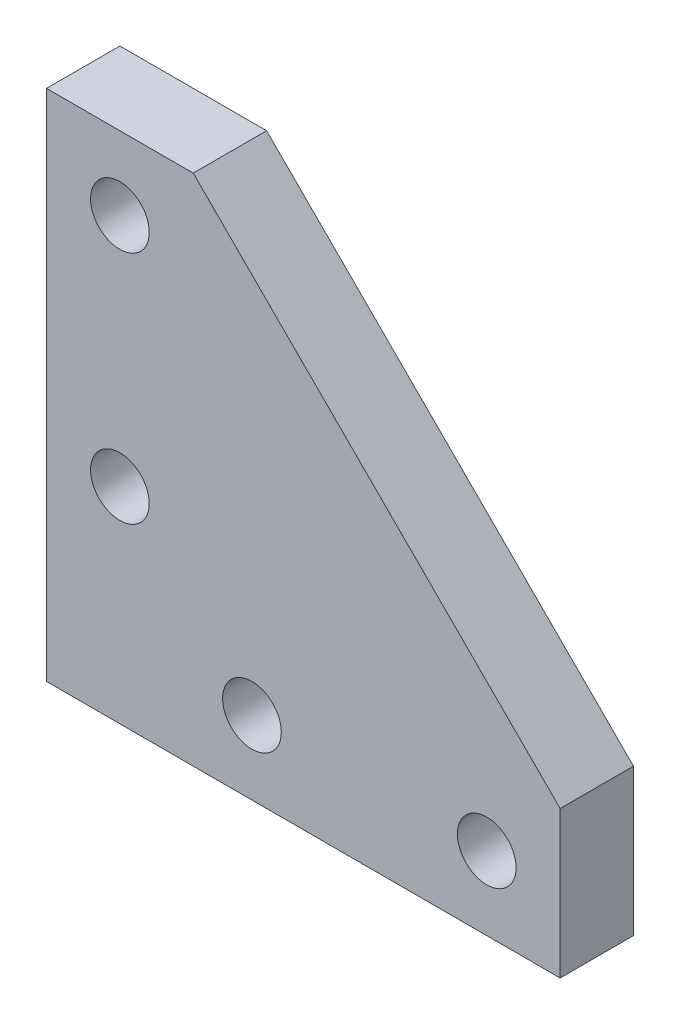
ISO-10303-21;
HEADER;
FILE_DESCRIPTION(('STEP AP214'),'2;1');
FILE_NAME('part.step','',(''),(''),'','','');
FILE_SCHEMA(('AUTOMOTIVE_DESIGN { 1 0 10303 214 1 1 1 1 }'));
ENDSEC;
DATA;
#1=APPLICATION_CONTEXT('core data for automotive mechanical design processes');
#2=APPLICATION_PROTOCOL_DEFINITION('international standard','automotive_design',2000,#1);
#3=PRODUCT_CONTEXT('',#1,'mechanical');
#4=PRODUCT('Part','Part','',(#3));
#5=PRODUCT_RELATED_PRODUCT_CATEGORY('part','',(#4));
#6=PRODUCT_DEFINITION_FORMATION('','',#4);
#7=PRODUCT_DEFINITION_CONTEXT('part definition',#1,'design');
#8=PRODUCT_DEFINITION('design','',#6,#7);
#9=PRODUCT_DEFINITION_SHAPE('','',#8);
#10=(LENGTH_UNIT() NAMED_UNIT(*) SI_UNIT(.MILLI.,.METRE.));
#11=(NAMED_UNIT(*) PLANE_ANGLE_UNIT() SI_UNIT($,.RADIAN.));
#12=(NAMED_UNIT(*) SI_UNIT($,.STERADIAN.) SOLID_ANGLE_UNIT());
#13=UNCERTAINTY_MEASURE_WITH_UNIT(LENGTH_MEASURE(1.E-05),#10,'distance_accuracy_value','');
#14=(GEOMETRIC_REPRESENTATION_CONTEXT(3) GLOBAL_UNCERTAINTY_ASSIGNED_CONTEXT((#13)) GLOBAL_UNIT_ASSIGNED_CONTEXT((#10,
#11,#12)) REPRESENTATION_CONTEXT('',''));
#15=CARTESIAN_POINT('',(0.,0.,0.));
#16=DIRECTION('',(0.,0.,1.));
#17=DIRECTION('',(1.,0.,0.));
#18=AXIS2_PLACEMENT_3D('',#15,#16,#17);
#19=CARTESIAN_POINT('',(0.,35.,5.));
#20=DIRECTION('',(1.,0.,0.));
#21=DIRECTION('',(0.,1.,0.));
#22=AXIS2_PLACEMENT_3D('',#19,#20,#21);
#23=PLANE('',#22);
#24=DIRECTION('',(0.,-1.,0.));
#25=VECTOR('',#24,1.);
#26=CARTESIAN_POINT('',(0.,35.,0.));
#27=LINE('',#26,#25);
#28=CARTESIAN_POINT('',(0.,35.,0.));
#29=VERTEX_POINT('',#28);
#30=CARTESIAN_POINT('',(0.,0.,0.));
#31=VERTEX_POINT('',#30);
#32=EDGE_CURVE('E108',#29,#31,#27,.T.);
#33=ORIENTED_EDGE('',*,*,#32,.T.);
#34=DIRECTION('',(0.,0.,-1.));
#35=VECTOR('',#34,1.);
#36=CARTESIAN_POINT('',(0.,0.,5.));
#37=LINE('',#36,#35);
#38=CARTESIAN_POINT('',(0.,0.,5.));
#39=VERTEX_POINT('',#38);
#40=EDGE_CURVE('E11',#39,#31,#37,.T.);
#41=ORIENTED_EDGE('',*,*,#40,.F.);
#42=DIRECTION('',(0.,-1.,0.));
#43=VECTOR('',#42,1.);
#44=CARTESIAN_POINT('',(0.,35.,5.));
#45=LINE('',#44,#43);
#46=CARTESIAN_POINT('',(0.,35.,5.));
#47=VERTEX_POINT('',#46);
#48=EDGE_CURVE('E117',#47,#39,#45,.T.);
#49=ORIENTED_EDGE('',*,*,#48,.F.);
#50=DIRECTION('',(0.,0.,-1.));
#51=VECTOR('',#50,1.);
#52=CARTESIAN_POINT('',(0.,35.,5.));
#53=LINE('',#52,#51);
#54=EDGE_CURVE('E104',#47,#29,#53,.T.);
#55=ORIENTED_EDGE('',*,*,#54,.T.);
#56=EDGE_LOOP('',(#33,#41,#49,#55));
#57=FACE_BOUND('',#56,.T.);
#58=ADVANCED_FACE('F34',(#57),#23,.F.);
#59=CARTESIAN_POINT('',(0.,0.,5.));
#60=DIRECTION('',(0.,1.,0.));
#61=DIRECTION('',(0.,0.,1.));
#62=AXIS2_PLACEMENT_3D('',#59,#60,#61);
#63=PLANE('',#62);
#64=DIRECTION('',(1.,0.,0.));
#65=VECTOR('',#64,1.);
#66=CARTESIAN_POINT('',(0.,0.,0.));
#67=LINE('',#66,#65);
#68=CARTESIAN_POINT('',(35.,0.,0.));
#69=VERTEX_POINT('',#68);
#70=EDGE_CURVE('E111',#31,#69,#67,.T.);
#71=ORIENTED_EDGE('',*,*,#70,.T.);
#72=DIRECTION('',(0.,0.,-1.));
#73=VECTOR('',#72,1.);
#74=CARTESIAN_POINT('',(35.,0.,5.));
#75=LINE('',#74,#73);
#76=CARTESIAN_POINT('',(35.,0.,5.));
#77=VERTEX_POINT('',#76);
#78=EDGE_CURVE('E42',#77,#69,#75,.T.);
#79=ORIENTED_EDGE('',*,*,#78,.F.);
#80=DIRECTION('',(1.,0.,0.));
#81=VECTOR('',#80,1.);
#82=CARTESIAN_POINT('',(0.,0.,5.));
#83=LINE('',#82,#81);
#84=EDGE_CURVE('E84',#39,#77,#83,.T.);
#85=ORIENTED_EDGE('',*,*,#84,.F.);
#86=ORIENTED_EDGE('',*,*,#40,.T.);
#87=EDGE_LOOP('',(#71,#79,#85,#86));
#88=FACE_BOUND('',#87,.T.);
#89=ADVANCED_FACE('F137',(#88),#63,.F.);
#90=CARTESIAN_POINT('',(35.,0.,5.));
#91=DIRECTION('',(-1.,0.,0.));
#92=DIRECTION('',(0.,0.,1.));
#93=AXIS2_PLACEMENT_3D('',#90,#91,#92);
#94=PLANE('',#93);
#95=DIRECTION('',(0.,1.,0.));
#96=VECTOR('',#95,1.);
#97=CARTESIAN_POINT('',(35.,0.,0.));
#98=LINE('',#97,#96);
#99=CARTESIAN_POINT('',(35.,10.,0.));
#100=VERTEX_POINT('',#99);
#101=EDGE_CURVE('E99',#69,#100,#98,.T.);
#102=ORIENTED_EDGE('',*,*,#101,.T.);
#103=DIRECTION('',(0.,0.,-1.));
#104=VECTOR('',#103,1.);
#105=CARTESIAN_POINT('',(35.,10.,5.));
#106=LINE('',#105,#104);
#107=CARTESIAN_POINT('',(35.,10.,5.));
#108=VERTEX_POINT('',#107);
#109=EDGE_CURVE('E96',#108,#100,#106,.T.);
#110=ORIENTED_EDGE('',*,*,#109,.F.);
#111=DIRECTION('',(0.,1.,0.));
#112=VECTOR('',#111,1.);
#113=CARTESIAN_POINT('',(35.,0.,5.));
#114=LINE('',#113,#112);
#115=EDGE_CURVE('E88',#77,#108,#114,.T.);
#116=ORIENTED_EDGE('',*,*,#115,.F.);
#117=ORIENTED_EDGE('',*,*,#78,.T.);
#118=EDGE_LOOP('',(#102,#110,#116,#117));
#119=FACE_BOUND('',#118,.T.);
#120=ADVANCED_FACE('F97',(#119),#94,.F.);
#121=CARTESIAN_POINT('',(35.,10.,5.));
#122=DIRECTION('',(-0.707106781186548,-0.707106781186548,0.));
#123=DIRECTION('',(0.707106781186548,-0.707106781186548,0.));
#124=AXIS2_PLACEMENT_3D('',#121,#122,#123);
#125=PLANE('',#124);
#126=DIRECTION('',(-0.707106781186547,0.707106781186547,0.));
#127=VECTOR('',#126,1.);
#128=CARTESIAN_POINT('',(35.,10.,0.));
#129=LINE('',#128,#127);
#130=CARTESIAN_POINT('',(10.,35.,0.));
#131=VERTEX_POINT('',#130);
#132=EDGE_CURVE('E70',#100,#131,#129,.T.);
#133=ORIENTED_EDGE('',*,*,#132,.T.);
#134=DIRECTION('',(0.,0.,-1.));
#135=VECTOR('',#134,1.);
#136=CARTESIAN_POINT('',(10.,35.,5.));
#137=LINE('',#136,#135);
#138=CARTESIAN_POINT('',(10.,35.,5.));
#139=VERTEX_POINT('',#138);
#140=EDGE_CURVE('E100',#139,#131,#137,.T.);
#141=ORIENTED_EDGE('',*,*,#140,.F.);
#142=DIRECTION('',(-0.707106781186547,0.707106781186547,0.));
#143=VECTOR('',#142,1.);
#144=CARTESIAN_POINT('',(35.,10.,5.));
#145=LINE('',#144,#143);
#146=EDGE_CURVE('E92',#108,#139,#145,.T.);
#147=ORIENTED_EDGE('',*,*,#146,.F.);
#148=ORIENTED_EDGE('',*,*,#109,.T.);
#149=EDGE_LOOP('',(#133,#141,#147,#148));
#150=FACE_BOUND('',#149,.T.);
#151=ADVANCED_FACE('F102',(#150),#125,.F.);
#152=CARTESIAN_POINT('',(10.,35.,5.));
#153=DIRECTION('',(0.,-1.,0.));
#154=DIRECTION('',(0.,0.,-1.));
#155=AXIS2_PLACEMENT_3D('',#152,#153,#154);
#156=PLANE('',#155);
#157=DIRECTION('',(-1.,0.,0.));
#158=VECTOR('',#157,1.);
#159=CARTESIAN_POINT('',(10.,35.,0.));
#160=LINE('',#159,#158);
#161=EDGE_CURVE('E76',#131,#29,#160,.T.);
#162=ORIENTED_EDGE('',*,*,#161,.T.);
#163=ORIENTED_EDGE('',*,*,#54,.F.);
#164=DIRECTION('',(-1.,0.,0.));
#165=VECTOR('',#164,1.);
#166=CARTESIAN_POINT('',(10.,35.,5.));
#167=LINE('',#166,#165);
#168=EDGE_CURVE('E50',#139,#47,#167,.T.);
#169=ORIENTED_EDGE('',*,*,#168,.F.);
#170=ORIENTED_EDGE('',*,*,#140,.T.);
#171=EDGE_LOOP('',(#162,#163,#169,#170));
#172=FACE_BOUND('',#171,.T.);
#173=ADVANCED_FACE('F125',(#172),#156,.F.);
#174=CARTESIAN_POINT('',(0.,0.,5.));
#175=DIRECTION('',(0.,0.,1.));
#176=DIRECTION('',(1.,0.,0.));
#177=AXIS2_PLACEMENT_3D('',#174,#175,#176);
#178=PLANE('',#177);
#179=CARTESIAN_POINT('',(30.,5.,5.));
#180=DIRECTION('',(0.,0.,1.));
#181=DIRECTION('',(1.,0.,0.));
#182=AXIS2_PLACEMENT_3D('',#179,#180,#181);
#183=CIRCLE('',#182,2.);
#184=CARTESIAN_POINT('',(32.,5.,5.));
#185=VERTEX_POINT('',#184);
#186=EDGE_CURVE('E219',#185,#185,#183,.T.);
#187=ORIENTED_EDGE('',*,*,#186,.F.);
#188=EDGE_LOOP('',(#187));
#189=FACE_BOUND('',#188,.T.);
#190=CARTESIAN_POINT('',(5.,30.,5.));
#191=DIRECTION('',(0.,0.,1.));
#192=DIRECTION('',(1.,0.,0.));
#193=AXIS2_PLACEMENT_3D('',#190,#191,#192);
#194=CIRCLE('',#193,2.);
#195=CARTESIAN_POINT('',(7.00000000000001,30.,5.));
#196=VERTEX_POINT('',#195);
#197=EDGE_CURVE('E225',#196,#196,#194,.T.);
#198=ORIENTED_EDGE('',*,*,#197,.F.);
#199=EDGE_LOOP('',(#198));
#200=FACE_BOUND('',#199,.T.);
#201=CARTESIAN_POINT('',(5.00000000000001,14.,5.));
#202=DIRECTION('',(0.,0.,1.));
#203=DIRECTION('',(1.,0.,0.));
#204=AXIS2_PLACEMENT_3D('',#201,#202,#203);
#205=CIRCLE('',#204,2.);
#206=CARTESIAN_POINT('',(7.00000000000001,14.,5.));
#207=VERTEX_POINT('',#206);
#208=EDGE_CURVE('E233',#207,#207,#205,.T.);
#209=ORIENTED_EDGE('',*,*,#208,.F.);
#210=EDGE_LOOP('',(#209));
#211=FACE_BOUND('',#210,.T.);
#212=CARTESIAN_POINT('',(14.,5.,5.));
#213=DIRECTION('',(0.,0.,1.));
#214=DIRECTION('',(1.,0.,0.));
#215=AXIS2_PLACEMENT_3D('',#212,#213,#214);
#216=CIRCLE('',#215,2.);
#217=CARTESIAN_POINT('',(16.,5.,5.));
#218=VERTEX_POINT('',#217);
#219=EDGE_CURVE('E222',#218,#218,#216,.T.);
#220=ORIENTED_EDGE('',*,*,#219,.F.);
#221=EDGE_LOOP('',(#220));
#222=FACE_BOUND('',#221,.T.);
#223=ORIENTED_EDGE('',*,*,#48,.T.);
#224=ORIENTED_EDGE('',*,*,#84,.T.);
#225=ORIENTED_EDGE('',*,*,#115,.T.);
#226=ORIENTED_EDGE('',*,*,#146,.T.);
#227=ORIENTED_EDGE('',*,*,#168,.T.);
#228=EDGE_LOOP('',(#223,#224,#225,#226,#227));
#229=FACE_BOUND('',#228,.T.);
#230=ADVANCED_FACE('F90',(#189,#200,#211,#222,#229),#178,.T.);
#231=CARTESIAN_POINT('',(0.,0.,0.));
#232=DIRECTION('',(0.,0.,1.));
#233=DIRECTION('',(1.,0.,0.));
#234=AXIS2_PLACEMENT_3D('',#231,#232,#233);
#235=PLANE('',#234);
#236=CARTESIAN_POINT('',(30.,5.,0.));
#237=DIRECTION('',(0.,0.,1.));
#238=DIRECTION('',(1.,0.,0.));
#239=AXIS2_PLACEMENT_3D('',#236,#237,#238);
#240=CIRCLE('',#239,2.);
#241=CARTESIAN_POINT('',(32.,5.,0.));
#242=VERTEX_POINT('',#241);
#243=EDGE_CURVE('E216',#242,#242,#240,.T.);
#244=ORIENTED_EDGE('',*,*,#243,.T.);
#245=EDGE_LOOP('',(#244));
#246=FACE_BOUND('',#245,.T.);
#247=CARTESIAN_POINT('',(5.,30.,0.));
#248=DIRECTION('',(0.,0.,1.));
#249=DIRECTION('',(1.,0.,0.));
#250=AXIS2_PLACEMENT_3D('',#247,#248,#249);
#251=CIRCLE('',#250,2.);
#252=CARTESIAN_POINT('',(7.00000000000001,30.,0.));
#253=VERTEX_POINT('',#252);
#254=EDGE_CURVE('E220',#253,#253,#251,.T.);
#255=ORIENTED_EDGE('',*,*,#254,.T.);
#256=EDGE_LOOP('',(#255));
#257=FACE_BOUND('',#256,.T.);
#258=CARTESIAN_POINT('',(5.00000000000001,14.,0.));
#259=DIRECTION('',(0.,0.,1.));
#260=DIRECTION('',(1.,0.,0.));
#261=AXIS2_PLACEMENT_3D('',#258,#259,#260);
#262=CIRCLE('',#261,2.);
#263=CARTESIAN_POINT('',(7.00000000000001,14.,0.));
#264=VERTEX_POINT('',#263);
#265=EDGE_CURVE('E230',#264,#264,#262,.T.);
#266=ORIENTED_EDGE('',*,*,#265,.T.);
#267=EDGE_LOOP('',(#266));
#268=FACE_BOUND('',#267,.T.);
#269=CARTESIAN_POINT('',(14.,5.,0.));
#270=DIRECTION('',(0.,0.,1.));
#271=DIRECTION('',(1.,0.,0.));
#272=AXIS2_PLACEMENT_3D('',#269,#270,#271);
#273=CIRCLE('',#272,2.);
#274=CARTESIAN_POINT('',(16.,5.,0.));
#275=VERTEX_POINT('',#274);
#276=EDGE_CURVE('E112',#275,#275,#273,.T.);
#277=ORIENTED_EDGE('',*,*,#276,.T.);
#278=EDGE_LOOP('',(#277));
#279=FACE_BOUND('',#278,.T.);
#280=ORIENTED_EDGE('',*,*,#32,.F.);
#281=ORIENTED_EDGE('',*,*,#161,.F.);
#282=ORIENTED_EDGE('',*,*,#132,.F.);
#283=ORIENTED_EDGE('',*,*,#101,.F.);
#284=ORIENTED_EDGE('',*,*,#70,.F.);
#285=EDGE_LOOP('',(#280,#281,#282,#283,#284));
#286=FACE_BOUND('',#285,.T.);
#287=ADVANCED_FACE('F121',(#246,#257,#268,#279,#286),#235,.F.);
#288=CARTESIAN_POINT('',(14.,5.,0.));
#289=DIRECTION('',(0.,0.,1.));
#290=DIRECTION('',(1.,0.,0.));
#291=AXIS2_PLACEMENT_3D('',#288,#289,#290);
#292=CYLINDRICAL_SURFACE('',#291,2.);
#293=ORIENTED_EDGE('',*,*,#276,.F.);
#294=EDGE_LOOP('',(#293));
#295=FACE_BOUND('',#294,.T.);
#296=ORIENTED_EDGE('',*,*,#219,.T.);
#297=EDGE_LOOP('',(#296));
#298=FACE_BOUND('',#297,.T.);
#299=ADVANCED_FACE('F170',(#295,#298),#292,.F.);
#300=CARTESIAN_POINT('',(5.00000000000001,14.,0.));
#301=DIRECTION('',(0.,0.,1.));
#302=DIRECTION('',(1.,0.,0.));
#303=AXIS2_PLACEMENT_3D('',#300,#301,#302);
#304=CYLINDRICAL_SURFACE('',#303,2.);
#305=ORIENTED_EDGE('',*,*,#265,.F.);
#306=EDGE_LOOP('',(#305));
#307=FACE_BOUND('',#306,.T.);
#308=ORIENTED_EDGE('',*,*,#208,.T.);
#309=EDGE_LOOP('',(#308));
#310=FACE_BOUND('',#309,.T.);
#311=ADVANCED_FACE('F179',(#307,#310),#304,.F.);
#312=CARTESIAN_POINT('',(5.,30.,0.));
#313=DIRECTION('',(0.,0.,1.));
#314=DIRECTION('',(1.,0.,0.));
#315=AXIS2_PLACEMENT_3D('',#312,#313,#314);
#316=CYLINDRICAL_SURFACE('',#315,2.);
#317=ORIENTED_EDGE('',*,*,#254,.F.);
#318=EDGE_LOOP('',(#317));
#319=FACE_BOUND('',#318,.T.);
#320=ORIENTED_EDGE('',*,*,#197,.T.);
#321=EDGE_LOOP('',(#320));
#322=FACE_BOUND('',#321,.T.);
#323=ADVANCED_FACE('F189',(#319,#322),#316,.F.);
#324=CARTESIAN_POINT('',(30.,5.,0.));
#325=DIRECTION('',(0.,0.,1.));
#326=DIRECTION('',(1.,0.,0.));
#327=AXIS2_PLACEMENT_3D('',#324,#325,#326);
#328=CYLINDRICAL_SURFACE('',#327,2.);
#329=ORIENTED_EDGE('',*,*,#243,.F.);
#330=EDGE_LOOP('',(#329));
#331=FACE_BOUND('',#330,.T.);
#332=ORIENTED_EDGE('',*,*,#186,.T.);
#333=EDGE_LOOP('',(#332));
#334=FACE_BOUND('',#333,.T.);
#335=ADVANCED_FACE('F199',(#331,#334),#328,.F.);
#336=CLOSED_SHELL('',(#58,#89,#120,#151,#173,#230,#287,#299,#311,#323,#335));
#337=MANIFOLD_SOLID_BREP('B2',#336);
#338=ADVANCED_BREP_SHAPE_REPRESENTATION('',(#18,#337),#14);
#339=SHAPE_DEFINITION_REPRESENTATION(#9,#338);
ENDSEC;
END-ISO-10303-21;
